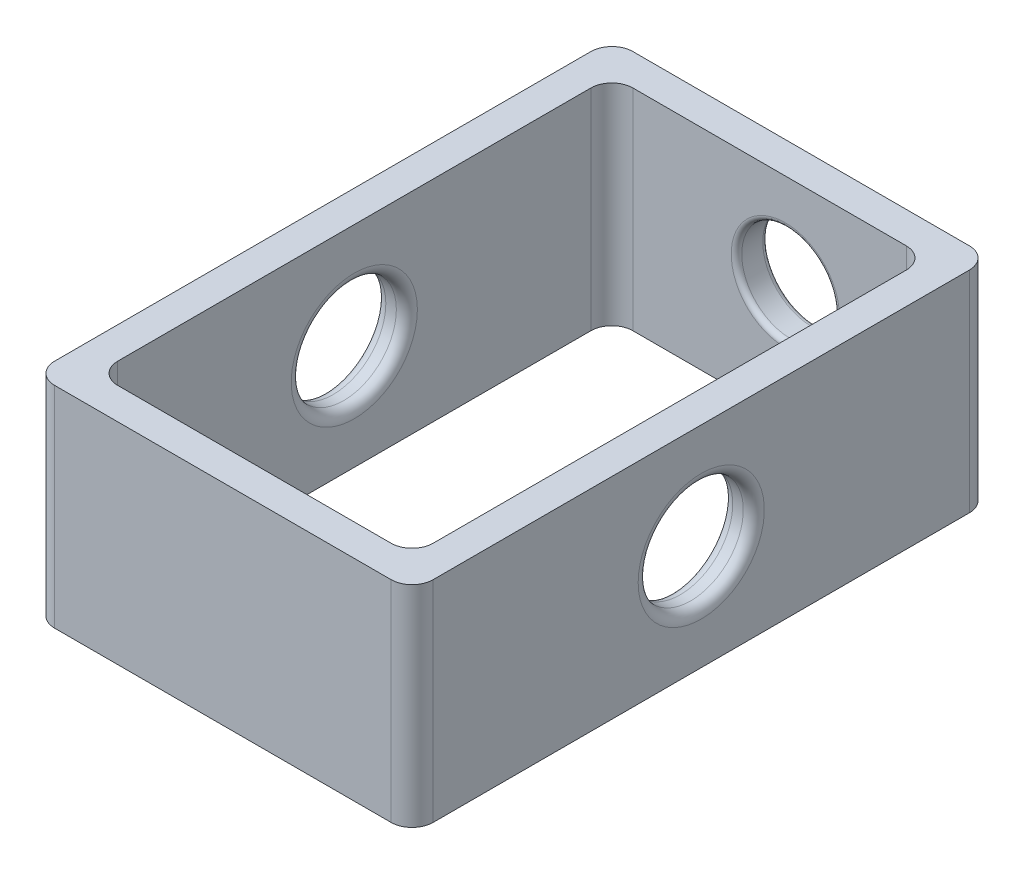
ISO-10303-21;
HEADER;
FILE_DESCRIPTION(('STEP AP214'),'2;1');
FILE_NAME('part.step','',(''),(''),'','','');
FILE_SCHEMA(('AUTOMOTIVE_DESIGN { 1 0 10303 214 1 1 1 1 }'));
ENDSEC;
DATA;
#1=APPLICATION_CONTEXT('core data for automotive mechanical design processes');
#2=APPLICATION_PROTOCOL_DEFINITION('international standard','automotive_design',2000,#1);
#3=PRODUCT_CONTEXT('',#1,'mechanical');
#4=PRODUCT('Part','Part','',(#3));
#5=PRODUCT_RELATED_PRODUCT_CATEGORY('part','',(#4));
#6=PRODUCT_DEFINITION_FORMATION('','',#4);
#7=PRODUCT_DEFINITION_CONTEXT('part definition',#1,'design');
#8=PRODUCT_DEFINITION('design','',#6,#7);
#9=PRODUCT_DEFINITION_SHAPE('','',#8);
#10=(LENGTH_UNIT() NAMED_UNIT(*) SI_UNIT(.MILLI.,.METRE.));
#11=(NAMED_UNIT(*) PLANE_ANGLE_UNIT() SI_UNIT($,.RADIAN.));
#12=(NAMED_UNIT(*) SI_UNIT($,.STERADIAN.) SOLID_ANGLE_UNIT());
#13=UNCERTAINTY_MEASURE_WITH_UNIT(LENGTH_MEASURE(1.E-05),#10,'distance_accuracy_value','');
#14=(GEOMETRIC_REPRESENTATION_CONTEXT(3) GLOBAL_UNCERTAINTY_ASSIGNED_CONTEXT((#13)) GLOBAL_UNIT_ASSIGNED_CONTEXT((#10,
#11,#12)) REPRESENTATION_CONTEXT('',''));
#15=CARTESIAN_POINT('',(0.,0.,0.));
#16=DIRECTION('',(0.,0.,1.));
#17=DIRECTION('',(1.,0.,0.));
#18=AXIS2_PLACEMENT_3D('',#15,#16,#17);
#19=CARTESIAN_POINT('',(-18.,10.,-27.5));
#20=DIRECTION('',(0.,0.,1.));
#21=DIRECTION('',(1.,0.,0.));
#22=AXIS2_PLACEMENT_3D('',#19,#20,#21);
#23=PLANE('',#22);
#24=CARTESIAN_POINT('',(1.50000000000001,1.,-27.5));
#25=DIRECTION('',(0.,0.,1.));
#26=DIRECTION('',(1.,0.,0.));
#27=AXIS2_PLACEMENT_3D('',#24,#25,#26);
#28=CIRCLE('',#27,5.15);
#29=CARTESIAN_POINT('',(6.65000000000001,1.,-27.5));
#30=VERTEX_POINT('',#29);
#31=EDGE_CURVE('E264',#30,#30,#28,.T.);
#32=ORIENTED_EDGE('',*,*,#31,.T.);
#33=EDGE_LOOP('',(#32));
#34=FACE_BOUND('',#33,.T.);
#35=DIRECTION('',(-1.,0.,0.));
#36=VECTOR('',#35,1.);
#37=CARTESIAN_POINT('',(-18.,10.,-27.5));
#38=LINE('',#37,#36);
#39=CARTESIAN_POINT('',(16.,10.,-27.5));
#40=VERTEX_POINT('',#39);
#41=CARTESIAN_POINT('',(-16.,10.,-27.5));
#42=VERTEX_POINT('',#41);
#43=EDGE_CURVE('E174',#40,#42,#38,.T.);
#44=ORIENTED_EDGE('',*,*,#43,.F.);
#45=DIRECTION('',(0.,-1.,0.));
#46=VECTOR('',#45,1.);
#47=CARTESIAN_POINT('',(16.,10.,-27.5));
#48=LINE('',#47,#46);
#49=CARTESIAN_POINT('',(16.,-10.,-27.5));
#50=VERTEX_POINT('',#49);
#51=EDGE_CURVE('E157',#40,#50,#48,.T.);
#52=ORIENTED_EDGE('',*,*,#51,.T.);
#53=DIRECTION('',(-1.,0.,0.));
#54=VECTOR('',#53,1.);
#55=CARTESIAN_POINT('',(-18.,-10.,-27.5));
#56=LINE('',#55,#54);
#57=CARTESIAN_POINT('',(-16.,-10.,-27.5));
#58=VERTEX_POINT('',#57);
#59=EDGE_CURVE('E175',#50,#58,#56,.T.);
#60=ORIENTED_EDGE('',*,*,#59,.T.);
#61=DIRECTION('',(0.,-1.,0.));
#62=VECTOR('',#61,1.);
#63=CARTESIAN_POINT('',(-16.,10.,-27.5));
#64=LINE('',#63,#62);
#65=EDGE_CURVE('E180',#58,#42,#64,.F.);
#66=ORIENTED_EDGE('',*,*,#65,.T.);
#67=EDGE_LOOP('',(#44,#52,#60,#66));
#68=FACE_BOUND('',#67,.T.);
#69=ADVANCED_FACE('F41',(#34,#68),#23,.F.);
#70=CARTESIAN_POINT('',(0.,10.,0.));
#71=DIRECTION('',(0.,-1.,0.));
#72=DIRECTION('',(0.,0.,-1.));
#73=AXIS2_PLACEMENT_3D('',#70,#71,#72);
#74=PLANE('',#73);
#75=DIRECTION('',(0.,0.,-1.));
#76=VECTOR('',#75,1.);
#77=CARTESIAN_POINT('',(18.,10.,27.5));
#78=LINE('',#77,#76);
#79=CARTESIAN_POINT('',(18.,10.,25.5));
#80=VERTEX_POINT('',#79);
#81=CARTESIAN_POINT('',(18.,10.,-25.5));
#82=VERTEX_POINT('',#81);
#83=EDGE_CURVE('E195',#80,#82,#78,.T.);
#84=ORIENTED_EDGE('',*,*,#83,.T.);
#85=CARTESIAN_POINT('',(16.,10.,-25.5));
#86=DIRECTION('',(0.,-1.,0.));
#87=DIRECTION('',(0.,0.,-1.));
#88=AXIS2_PLACEMENT_3D('',#85,#86,#87);
#89=CIRCLE('',#88,2.);
#90=EDGE_CURVE('E208',#82,#40,#89,.F.);
#91=ORIENTED_EDGE('',*,*,#90,.T.);
#92=ORIENTED_EDGE('',*,*,#43,.T.);
#93=CARTESIAN_POINT('',(-16.,10.,-25.5));
#94=DIRECTION('',(0.,-1.,0.));
#95=DIRECTION('',(0.,0.,-1.));
#96=AXIS2_PLACEMENT_3D('',#93,#94,#95);
#97=CIRCLE('',#96,2.);
#98=CARTESIAN_POINT('',(-18.,10.,-25.5));
#99=VERTEX_POINT('',#98);
#100=EDGE_CURVE('E206',#42,#99,#97,.F.);
#101=ORIENTED_EDGE('',*,*,#100,.T.);
#102=DIRECTION('',(0.,0.,1.));
#103=VECTOR('',#102,1.);
#104=CARTESIAN_POINT('',(-18.,10.,27.5));
#105=LINE('',#104,#103);
#106=CARTESIAN_POINT('',(-18.,10.,25.5));
#107=VERTEX_POINT('',#106);
#108=EDGE_CURVE('E411',#99,#107,#105,.T.);
#109=ORIENTED_EDGE('',*,*,#108,.T.);
#110=CARTESIAN_POINT('',(-16.,10.,25.5));
#111=DIRECTION('',(0.,-1.,0.));
#112=DIRECTION('',(0.,0.,-1.));
#113=AXIS2_PLACEMENT_3D('',#110,#111,#112);
#114=CIRCLE('',#113,2.);
#115=CARTESIAN_POINT('',(-16.,10.,27.5));
#116=VERTEX_POINT('',#115);
#117=EDGE_CURVE('E207',#107,#116,#114,.F.);
#118=ORIENTED_EDGE('',*,*,#117,.T.);
#119=DIRECTION('',(1.,0.,0.));
#120=VECTOR('',#119,1.);
#121=CARTESIAN_POINT('',(-18.,10.,27.5));
#122=LINE('',#121,#120);
#123=CARTESIAN_POINT('',(16.,10.,27.5));
#124=VERTEX_POINT('',#123);
#125=EDGE_CURVE('E191',#116,#124,#122,.T.);
#126=ORIENTED_EDGE('',*,*,#125,.T.);
#127=CARTESIAN_POINT('',(16.,10.,25.5));
#128=DIRECTION('',(0.,-1.,0.));
#129=DIRECTION('',(0.,0.,-1.));
#130=AXIS2_PLACEMENT_3D('',#127,#128,#129);
#131=CIRCLE('',#130,2.);
#132=EDGE_CURVE('E203',#124,#80,#131,.F.);
#133=ORIENTED_EDGE('',*,*,#132,.T.);
#134=EDGE_LOOP('',(#84,#91,#92,#101,#109,#118,#126,#133));
#135=FACE_BOUND('',#134,.T.);
#136=DIRECTION('',(0.,0.,1.));
#137=VECTOR('',#136,1.);
#138=CARTESIAN_POINT('',(-15.,10.,24.5));
#139=LINE('',#138,#137);
#140=CARTESIAN_POINT('',(-15.,10.,-22.5));
#141=VERTEX_POINT('',#140);
#142=CARTESIAN_POINT('',(-15.,10.,22.5));
#143=VERTEX_POINT('',#142);
#144=EDGE_CURVE('E430',#141,#143,#139,.T.);
#145=ORIENTED_EDGE('',*,*,#144,.F.);
#146=CARTESIAN_POINT('',(-13.,10.,-22.5));
#147=DIRECTION('',(0.,-1.,0.));
#148=DIRECTION('',(0.,0.,-1.));
#149=AXIS2_PLACEMENT_3D('',#146,#147,#148);
#150=CIRCLE('',#149,2.);
#151=CARTESIAN_POINT('',(-13.,10.,-24.5));
#152=VERTEX_POINT('',#151);
#153=EDGE_CURVE('E252',#141,#152,#150,.T.);
#154=ORIENTED_EDGE('',*,*,#153,.T.);
#155=DIRECTION('',(-1.,0.,0.));
#156=VECTOR('',#155,1.);
#157=CARTESIAN_POINT('',(15.,10.,-24.5));
#158=LINE('',#157,#156);
#159=CARTESIAN_POINT('',(13.,10.,-24.5));
#160=VERTEX_POINT('',#159);
#161=EDGE_CURVE('E189',#160,#152,#158,.T.);
#162=ORIENTED_EDGE('',*,*,#161,.F.);
#163=CARTESIAN_POINT('',(13.,10.,-22.5));
#164=DIRECTION('',(0.,-1.,0.));
#165=DIRECTION('',(0.,0.,-1.));
#166=AXIS2_PLACEMENT_3D('',#163,#164,#165);
#167=CIRCLE('',#166,2.);
#168=CARTESIAN_POINT('',(15.,10.,-22.5));
#169=VERTEX_POINT('',#168);
#170=EDGE_CURVE('E250',#160,#169,#167,.T.);
#171=ORIENTED_EDGE('',*,*,#170,.T.);
#172=DIRECTION('',(0.,0.,-1.));
#173=VECTOR('',#172,1.);
#174=CARTESIAN_POINT('',(15.,10.,24.5));
#175=LINE('',#174,#173);
#176=CARTESIAN_POINT('',(15.,10.,22.5));
#177=VERTEX_POINT('',#176);
#178=EDGE_CURVE('E437',#177,#169,#175,.T.);
#179=ORIENTED_EDGE('',*,*,#178,.F.);
#180=CARTESIAN_POINT('',(13.,10.,22.5));
#181=DIRECTION('',(0.,-1.,0.));
#182=DIRECTION('',(0.,0.,-1.));
#183=AXIS2_PLACEMENT_3D('',#180,#181,#182);
#184=CIRCLE('',#183,2.);
#185=CARTESIAN_POINT('',(13.,10.,24.5));
#186=VERTEX_POINT('',#185);
#187=EDGE_CURVE('E243',#177,#186,#184,.T.);
#188=ORIENTED_EDGE('',*,*,#187,.T.);
#189=DIRECTION('',(1.,0.,0.));
#190=VECTOR('',#189,1.);
#191=CARTESIAN_POINT('',(15.,10.,24.5));
#192=LINE('',#191,#190);
#193=CARTESIAN_POINT('',(-13.,10.,24.5));
#194=VERTEX_POINT('',#193);
#195=EDGE_CURVE('E445',#194,#186,#192,.T.);
#196=ORIENTED_EDGE('',*,*,#195,.F.);
#197=CARTESIAN_POINT('',(-13.,10.,22.5));
#198=DIRECTION('',(0.,-1.,0.));
#199=DIRECTION('',(0.,0.,-1.));
#200=AXIS2_PLACEMENT_3D('',#197,#198,#199);
#201=CIRCLE('',#200,2.);
#202=EDGE_CURVE('E57',#194,#143,#201,.T.);
#203=ORIENTED_EDGE('',*,*,#202,.T.);
#204=EDGE_LOOP('',(#145,#154,#162,#171,#179,#188,#196,#203));
#205=FACE_BOUND('',#204,.T.);
#206=ADVANCED_FACE('F311',(#135,#205),#74,.F.);
#207=CARTESIAN_POINT('',(0.,-10.,0.));
#208=DIRECTION('',(0.,-1.,0.));
#209=DIRECTION('',(0.,0.,-1.));
#210=AXIS2_PLACEMENT_3D('',#207,#208,#209);
#211=PLANE('',#210);
#212=ORIENTED_EDGE('',*,*,#59,.F.);
#213=CARTESIAN_POINT('',(16.,-10.,-25.5));
#214=DIRECTION('',(0.,-1.,0.));
#215=DIRECTION('',(0.,0.,-1.));
#216=AXIS2_PLACEMENT_3D('',#213,#214,#215);
#217=CIRCLE('',#216,2.);
#218=CARTESIAN_POINT('',(18.,-10.,-25.5));
#219=VERTEX_POINT('',#218);
#220=EDGE_CURVE('E159',#50,#219,#217,.T.);
#221=ORIENTED_EDGE('',*,*,#220,.T.);
#222=DIRECTION('',(0.,0.,-1.));
#223=VECTOR('',#222,1.);
#224=CARTESIAN_POINT('',(18.,-10.,27.5));
#225=LINE('',#224,#223);
#226=CARTESIAN_POINT('',(18.,-10.,25.5));
#227=VERTEX_POINT('',#226);
#228=EDGE_CURVE('E182',#227,#219,#225,.T.);
#229=ORIENTED_EDGE('',*,*,#228,.F.);
#230=CARTESIAN_POINT('',(16.,-10.,25.5));
#231=DIRECTION('',(0.,-1.,0.));
#232=DIRECTION('',(0.,0.,-1.));
#233=AXIS2_PLACEMENT_3D('',#230,#231,#232);
#234=CIRCLE('',#233,2.);
#235=CARTESIAN_POINT('',(16.,-10.,27.5));
#236=VERTEX_POINT('',#235);
#237=EDGE_CURVE('E176',#227,#236,#234,.T.);
#238=ORIENTED_EDGE('',*,*,#237,.T.);
#239=DIRECTION('',(1.,0.,0.));
#240=VECTOR('',#239,1.);
#241=CARTESIAN_POINT('',(-18.,-10.,27.5));
#242=LINE('',#241,#240);
#243=CARTESIAN_POINT('',(-16.,-10.,27.5));
#244=VERTEX_POINT('',#243);
#245=EDGE_CURVE('E187',#244,#236,#242,.T.);
#246=ORIENTED_EDGE('',*,*,#245,.F.);
#247=CARTESIAN_POINT('',(-16.,-10.,25.5));
#248=DIRECTION('',(0.,-1.,0.));
#249=DIRECTION('',(0.,0.,-1.));
#250=AXIS2_PLACEMENT_3D('',#247,#248,#249);
#251=CIRCLE('',#250,2.);
#252=CARTESIAN_POINT('',(-18.,-10.,25.5));
#253=VERTEX_POINT('',#252);
#254=EDGE_CURVE('E198',#244,#253,#251,.T.);
#255=ORIENTED_EDGE('',*,*,#254,.T.);
#256=DIRECTION('',(0.,0.,1.));
#257=VECTOR('',#256,1.);
#258=CARTESIAN_POINT('',(-18.,-10.,27.5));
#259=LINE('',#258,#257);
#260=CARTESIAN_POINT('',(-18.,-10.,-25.5));
#261=VERTEX_POINT('',#260);
#262=EDGE_CURVE('E185',#261,#253,#259,.T.);
#263=ORIENTED_EDGE('',*,*,#262,.F.);
#264=CARTESIAN_POINT('',(-16.,-10.,-25.5));
#265=DIRECTION('',(0.,-1.,0.));
#266=DIRECTION('',(0.,0.,-1.));
#267=AXIS2_PLACEMENT_3D('',#264,#265,#266);
#268=CIRCLE('',#267,2.);
#269=EDGE_CURVE('E170',#261,#58,#268,.T.);
#270=ORIENTED_EDGE('',*,*,#269,.T.);
#271=EDGE_LOOP('',(#212,#221,#229,#238,#246,#255,#263,#270));
#272=FACE_BOUND('',#271,.T.);
#273=DIRECTION('',(0.,0.,-1.));
#274=VECTOR('',#273,1.);
#275=CARTESIAN_POINT('',(15.,-10.,24.5));
#276=LINE('',#275,#274);
#277=CARTESIAN_POINT('',(15.,-10.,22.5));
#278=VERTEX_POINT('',#277);
#279=CARTESIAN_POINT('',(15.,-10.,-22.5));
#280=VERTEX_POINT('',#279);
#281=EDGE_CURVE('E426',#278,#280,#276,.T.);
#282=ORIENTED_EDGE('',*,*,#281,.T.);
#283=CARTESIAN_POINT('',(13.,-10.,-22.5));
#284=DIRECTION('',(0.,-1.,0.));
#285=DIRECTION('',(0.,0.,-1.));
#286=AXIS2_PLACEMENT_3D('',#283,#284,#285);
#287=CIRCLE('',#286,2.);
#288=CARTESIAN_POINT('',(13.,-10.,-24.5));
#289=VERTEX_POINT('',#288);
#290=EDGE_CURVE('E244',#280,#289,#287,.F.);
#291=ORIENTED_EDGE('',*,*,#290,.T.);
#292=DIRECTION('',(-1.,0.,0.));
#293=VECTOR('',#292,1.);
#294=CARTESIAN_POINT('',(15.,-10.,-24.5));
#295=LINE('',#294,#293);
#296=CARTESIAN_POINT('',(-13.,-10.,-24.5));
#297=VERTEX_POINT('',#296);
#298=EDGE_CURVE('E425',#289,#297,#295,.T.);
#299=ORIENTED_EDGE('',*,*,#298,.T.);
#300=CARTESIAN_POINT('',(-13.,-10.,-22.5));
#301=DIRECTION('',(0.,-1.,0.));
#302=DIRECTION('',(0.,0.,-1.));
#303=AXIS2_PLACEMENT_3D('',#300,#301,#302);
#304=CIRCLE('',#303,2.);
#305=CARTESIAN_POINT('',(-15.,-10.,-22.5));
#306=VERTEX_POINT('',#305);
#307=EDGE_CURVE('E248',#297,#306,#304,.F.);
#308=ORIENTED_EDGE('',*,*,#307,.T.);
#309=DIRECTION('',(0.,0.,1.));
#310=VECTOR('',#309,1.);
#311=CARTESIAN_POINT('',(-15.,-10.,24.5));
#312=LINE('',#311,#310);
#313=CARTESIAN_POINT('',(-15.,-10.,22.5));
#314=VERTEX_POINT('',#313);
#315=EDGE_CURVE('E432',#306,#314,#312,.T.);
#316=ORIENTED_EDGE('',*,*,#315,.T.);
#317=CARTESIAN_POINT('',(-13.,-10.,22.5));
#318=DIRECTION('',(0.,-1.,0.));
#319=DIRECTION('',(0.,0.,-1.));
#320=AXIS2_PLACEMENT_3D('',#317,#318,#319);
#321=CIRCLE('',#320,2.);
#322=CARTESIAN_POINT('',(-13.,-10.,24.5));
#323=VERTEX_POINT('',#322);
#324=EDGE_CURVE('E254',#314,#323,#321,.F.);
#325=ORIENTED_EDGE('',*,*,#324,.T.);
#326=DIRECTION('',(1.,0.,0.));
#327=VECTOR('',#326,1.);
#328=CARTESIAN_POINT('',(15.,-10.,24.5));
#329=LINE('',#328,#327);
#330=CARTESIAN_POINT('',(13.,-10.,24.5));
#331=VERTEX_POINT('',#330);
#332=EDGE_CURVE('E431',#323,#331,#329,.T.);
#333=ORIENTED_EDGE('',*,*,#332,.T.);
#334=CARTESIAN_POINT('',(13.,-10.,22.5));
#335=DIRECTION('',(0.,-1.,0.));
#336=DIRECTION('',(0.,0.,-1.));
#337=AXIS2_PLACEMENT_3D('',#334,#335,#336);
#338=CIRCLE('',#337,2.);
#339=EDGE_CURVE('E241',#331,#278,#338,.F.);
#340=ORIENTED_EDGE('',*,*,#339,.T.);
#341=EDGE_LOOP('',(#282,#291,#299,#308,#316,#325,#333,#340));
#342=FACE_BOUND('',#341,.T.);
#343=ADVANCED_FACE('F177',(#272,#342),#211,.T.);
#344=CARTESIAN_POINT('',(18.,10.,27.5));
#345=DIRECTION('',(-1.,0.,0.));
#346=DIRECTION('',(0.,0.,1.));
#347=AXIS2_PLACEMENT_3D('',#344,#345,#346);
#348=PLANE('',#347);
#349=CARTESIAN_POINT('',(18.,0.,0.));
#350=DIRECTION('',(-1.,0.,0.));
#351=DIRECTION('',(0.,0.,1.));
#352=AXIS2_PLACEMENT_3D('',#349,#350,#351);
#353=CIRCLE('',#352,6.);
#354=CARTESIAN_POINT('',(18.,0.,6.));
#355=VERTEX_POINT('',#354);
#356=EDGE_CURVE('E11',#355,#355,#353,.T.);
#357=ORIENTED_EDGE('',*,*,#356,.T.);
#358=EDGE_LOOP('',(#357));
#359=FACE_BOUND('',#358,.T.);
#360=ORIENTED_EDGE('',*,*,#228,.T.);
#361=DIRECTION('',(0.,-1.,0.));
#362=VECTOR('',#361,1.);
#363=CARTESIAN_POINT('',(18.,10.,-25.5));
#364=LINE('',#363,#362);
#365=EDGE_CURVE('E163',#219,#82,#364,.F.);
#366=ORIENTED_EDGE('',*,*,#365,.T.);
#367=ORIENTED_EDGE('',*,*,#83,.F.);
#368=DIRECTION('',(0.,-1.,0.));
#369=VECTOR('',#368,1.);
#370=CARTESIAN_POINT('',(18.,10.,25.5));
#371=LINE('',#370,#369);
#372=EDGE_CURVE('E168',#80,#227,#371,.T.);
#373=ORIENTED_EDGE('',*,*,#372,.T.);
#374=EDGE_LOOP('',(#360,#366,#367,#373));
#375=FACE_BOUND('',#374,.T.);
#376=ADVANCED_FACE('F321',(#359,#375),#348,.F.);
#377=CARTESIAN_POINT('',(-18.,10.,27.5));
#378=DIRECTION('',(1.,0.,0.));
#379=DIRECTION('',(0.,0.,-1.));
#380=AXIS2_PLACEMENT_3D('',#377,#378,#379);
#381=PLANE('',#380);
#382=CARTESIAN_POINT('',(-18.,0.,0.));
#383=DIRECTION('',(1.,0.,0.));
#384=DIRECTION('',(0.,0.,-1.));
#385=AXIS2_PLACEMENT_3D('',#382,#383,#384);
#386=CIRCLE('',#385,6.);
#387=CARTESIAN_POINT('',(-18.,0.,-6.));
#388=VERTEX_POINT('',#387);
#389=EDGE_CURVE('E274',#388,#388,#386,.T.);
#390=ORIENTED_EDGE('',*,*,#389,.T.);
#391=EDGE_LOOP('',(#390));
#392=FACE_BOUND('',#391,.T.);
#393=ORIENTED_EDGE('',*,*,#108,.F.);
#394=DIRECTION('',(0.,-1.,0.));
#395=VECTOR('',#394,1.);
#396=CARTESIAN_POINT('',(-18.,10.,-25.5));
#397=LINE('',#396,#395);
#398=EDGE_CURVE('E215',#99,#261,#397,.T.);
#399=ORIENTED_EDGE('',*,*,#398,.T.);
#400=ORIENTED_EDGE('',*,*,#262,.T.);
#401=DIRECTION('',(0.,-1.,0.));
#402=VECTOR('',#401,1.);
#403=CARTESIAN_POINT('',(-18.,10.,25.5));
#404=LINE('',#403,#402);
#405=EDGE_CURVE('E214',#253,#107,#404,.F.);
#406=ORIENTED_EDGE('',*,*,#405,.T.);
#407=EDGE_LOOP('',(#393,#399,#400,#406));
#408=FACE_BOUND('',#407,.T.);
#409=ADVANCED_FACE('F322',(#392,#408),#381,.F.);
#410=CARTESIAN_POINT('',(-18.,10.,27.5));
#411=DIRECTION('',(0.,0.,-1.));
#412=DIRECTION('',(-1.,0.,0.));
#413=AXIS2_PLACEMENT_3D('',#410,#411,#412);
#414=PLANE('',#413);
#415=ORIENTED_EDGE('',*,*,#125,.F.);
#416=DIRECTION('',(0.,-1.,0.));
#417=VECTOR('',#416,1.);
#418=CARTESIAN_POINT('',(-16.,10.,27.5));
#419=LINE('',#418,#417);
#420=EDGE_CURVE('E217',#116,#244,#419,.T.);
#421=ORIENTED_EDGE('',*,*,#420,.T.);
#422=ORIENTED_EDGE('',*,*,#245,.T.);
#423=DIRECTION('',(0.,-1.,0.));
#424=VECTOR('',#423,1.);
#425=CARTESIAN_POINT('',(16.,10.,27.5));
#426=LINE('',#425,#424);
#427=EDGE_CURVE('E220',#236,#124,#426,.F.);
#428=ORIENTED_EDGE('',*,*,#427,.T.);
#429=EDGE_LOOP('',(#415,#421,#422,#428));
#430=FACE_BOUND('',#429,.T.);
#431=ADVANCED_FACE('F394',(#430),#414,.F.);
#432=CARTESIAN_POINT('',(-15.,10.,24.5));
#433=DIRECTION('',(1.,0.,0.));
#434=DIRECTION('',(0.,0.,-1.));
#435=AXIS2_PLACEMENT_3D('',#432,#433,#434);
#436=PLANE('',#435);
#437=CARTESIAN_POINT('',(-15.,0.,0.));
#438=DIRECTION('',(1.,0.,0.));
#439=DIRECTION('',(0.,0.,-1.));
#440=AXIS2_PLACEMENT_3D('',#437,#438,#439);
#441=CIRCLE('',#440,6.);
#442=CARTESIAN_POINT('',(-15.,0.,-6.));
#443=VERTEX_POINT('',#442);
#444=EDGE_CURVE('E279',#443,#443,#441,.F.);
#445=ORIENTED_EDGE('',*,*,#444,.T.);
#446=EDGE_LOOP('',(#445));
#447=FACE_BOUND('',#446,.T.);
#448=ORIENTED_EDGE('',*,*,#315,.F.);
#449=DIRECTION('',(0.,-1.,0.));
#450=VECTOR('',#449,1.);
#451=CARTESIAN_POINT('',(-15.,10.,-22.5));
#452=LINE('',#451,#450);
#453=EDGE_CURVE('E62',#306,#141,#452,.F.);
#454=ORIENTED_EDGE('',*,*,#453,.T.);
#455=ORIENTED_EDGE('',*,*,#144,.T.);
#456=DIRECTION('',(0.,-1.,0.));
#457=VECTOR('',#456,1.);
#458=CARTESIAN_POINT('',(-15.,-10.,22.5));
#459=LINE('',#458,#457);
#460=EDGE_CURVE('E240',#143,#314,#459,.T.);
#461=ORIENTED_EDGE('',*,*,#460,.T.);
#462=EDGE_LOOP('',(#448,#454,#455,#461));
#463=FACE_BOUND('',#462,.T.);
#464=ADVANCED_FACE('F395',(#447,#463),#436,.T.);
#465=CARTESIAN_POINT('',(15.,10.,24.5));
#466=DIRECTION('',(0.,0.,-1.));
#467=DIRECTION('',(-1.,0.,0.));
#468=AXIS2_PLACEMENT_3D('',#465,#466,#467);
#469=PLANE('',#468);
#470=ORIENTED_EDGE('',*,*,#195,.T.);
#471=DIRECTION('',(0.,-1.,0.));
#472=VECTOR('',#471,1.);
#473=CARTESIAN_POINT('',(13.,-10.,24.5));
#474=LINE('',#473,#472);
#475=EDGE_CURVE('E223',#186,#331,#474,.T.);
#476=ORIENTED_EDGE('',*,*,#475,.T.);
#477=ORIENTED_EDGE('',*,*,#332,.F.);
#478=DIRECTION('',(0.,-1.,0.));
#479=VECTOR('',#478,1.);
#480=CARTESIAN_POINT('',(-13.,10.,24.5));
#481=LINE('',#480,#479);
#482=EDGE_CURVE('E221',#323,#194,#481,.F.);
#483=ORIENTED_EDGE('',*,*,#482,.T.);
#484=EDGE_LOOP('',(#470,#476,#477,#483));
#485=FACE_BOUND('',#484,.T.);
#486=ADVANCED_FACE('F390',(#485),#469,.T.);
#487=CARTESIAN_POINT('',(15.,10.,24.5));
#488=DIRECTION('',(-1.,0.,0.));
#489=DIRECTION('',(0.,0.,1.));
#490=AXIS2_PLACEMENT_3D('',#487,#488,#489);
#491=PLANE('',#490);
#492=CARTESIAN_POINT('',(15.,0.,0.));
#493=DIRECTION('',(-1.,0.,0.));
#494=DIRECTION('',(0.,0.,1.));
#495=AXIS2_PLACEMENT_3D('',#492,#493,#494);
#496=CIRCLE('',#495,6.);
#497=CARTESIAN_POINT('',(15.,0.,6.));
#498=VERTEX_POINT('',#497);
#499=EDGE_CURVE('E47',#498,#498,#496,.F.);
#500=ORIENTED_EDGE('',*,*,#499,.T.);
#501=EDGE_LOOP('',(#500));
#502=FACE_BOUND('',#501,.T.);
#503=ORIENTED_EDGE('',*,*,#281,.F.);
#504=DIRECTION('',(0.,-1.,0.));
#505=VECTOR('',#504,1.);
#506=CARTESIAN_POINT('',(15.,10.,22.5));
#507=LINE('',#506,#505);
#508=EDGE_CURVE('E229',#278,#177,#507,.F.);
#509=ORIENTED_EDGE('',*,*,#508,.T.);
#510=ORIENTED_EDGE('',*,*,#178,.T.);
#511=DIRECTION('',(0.,-1.,0.));
#512=VECTOR('',#511,1.);
#513=CARTESIAN_POINT('',(15.,-10.,-22.5));
#514=LINE('',#513,#512);
#515=EDGE_CURVE('E227',#169,#280,#514,.T.);
#516=ORIENTED_EDGE('',*,*,#515,.T.);
#517=EDGE_LOOP('',(#503,#509,#510,#516));
#518=FACE_BOUND('',#517,.T.);
#519=ADVANCED_FACE('F290',(#502,#518),#491,.T.);
#520=CARTESIAN_POINT('',(15.,10.,-24.5));
#521=DIRECTION('',(0.,0.,1.));
#522=DIRECTION('',(1.,0.,0.));
#523=AXIS2_PLACEMENT_3D('',#520,#521,#522);
#524=PLANE('',#523);
#525=CARTESIAN_POINT('',(1.50000000000001,1.,-24.5));
#526=DIRECTION('',(0.,0.,1.));
#527=DIRECTION('',(1.,0.,0.));
#528=AXIS2_PLACEMENT_3D('',#525,#526,#527);
#529=CIRCLE('',#528,5.15);
#530=CARTESIAN_POINT('',(6.65000000000001,1.,-24.5));
#531=VERTEX_POINT('',#530);
#532=EDGE_CURVE('E258',#531,#531,#529,.F.);
#533=ORIENTED_EDGE('',*,*,#532,.T.);
#534=EDGE_LOOP('',(#533));
#535=FACE_BOUND('',#534,.T.);
#536=ORIENTED_EDGE('',*,*,#298,.F.);
#537=DIRECTION('',(0.,-1.,0.));
#538=VECTOR('',#537,1.);
#539=CARTESIAN_POINT('',(13.,10.,-24.5));
#540=LINE('',#539,#538);
#541=EDGE_CURVE('E232',#289,#160,#540,.F.);
#542=ORIENTED_EDGE('',*,*,#541,.T.);
#543=ORIENTED_EDGE('',*,*,#161,.T.);
#544=DIRECTION('',(0.,-1.,0.));
#545=VECTOR('',#544,1.);
#546=CARTESIAN_POINT('',(-13.,-10.,-24.5));
#547=LINE('',#546,#545);
#548=EDGE_CURVE('E235',#152,#297,#547,.T.);
#549=ORIENTED_EDGE('',*,*,#548,.T.);
#550=EDGE_LOOP('',(#536,#542,#543,#549));
#551=FACE_BOUND('',#550,.T.);
#552=ADVANCED_FACE('F301',(#535,#551),#524,.T.);
#553=CARTESIAN_POINT('',(32.142135623731,0.,0.));
#554=DIRECTION('',(-1.,0.,0.));
#555=DIRECTION('',(0.,0.,1.));
#556=AXIS2_PLACEMENT_3D('',#553,#554,#555);
#557=CYLINDRICAL_SURFACE('',#556,5.);
#558=CARTESIAN_POINT('',(16.,0.,0.));
#559=DIRECTION('',(-1.,0.,0.));
#560=DIRECTION('',(0.,0.,1.));
#561=AXIS2_PLACEMENT_3D('',#558,#559,#560);
#562=CIRCLE('',#561,5.);
#563=CARTESIAN_POINT('',(16.,0.,5.));
#564=VERTEX_POINT('',#563);
#565=EDGE_CURVE('E283',#564,#564,#562,.T.);
#566=CARTESIAN_POINT('',(17.,0.,0.));
#567=DIRECTION('',(-1.,0.,0.));
#568=DIRECTION('',(0.,0.,1.));
#569=AXIS2_PLACEMENT_3D('',#566,#567,#568);
#570=CIRCLE('',#569,5.);
#571=CARTESIAN_POINT('',(17.,0.,5.));
#572=VERTEX_POINT('',#571);
#573=EDGE_CURVE('E276',#572,#572,#570,.F.);
#574=CARTESIAN_POINT('',(16.,0.,5.));
#575=CARTESIAN_POINT('',(16.0104166666667,0.,5.));
#576=CARTESIAN_POINT('',(16.0208333333333,0.,5.));
#577=CARTESIAN_POINT('',(16.0416666666667,0.,5.));
#578=CARTESIAN_POINT('',(16.0520833333333,0.,5.));
#579=CARTESIAN_POINT('',(16.0729166666667,0.,5.));
#580=CARTESIAN_POINT('',(16.0833333333333,0.,5.));
#581=CARTESIAN_POINT('',(16.1041666666667,0.,5.));
#582=CARTESIAN_POINT('',(16.1145833333333,0.,5.));
#583=CARTESIAN_POINT('',(16.1354166666667,0.,5.));
#584=CARTESIAN_POINT('',(16.1458333333333,0.,5.));
#585=CARTESIAN_POINT('',(16.1666666666667,0.,5.));
#586=CARTESIAN_POINT('',(16.1770833333333,0.,5.));
#587=CARTESIAN_POINT('',(16.1979166666667,0.,5.));
#588=CARTESIAN_POINT('',(16.2083333333333,0.,5.));
#589=CARTESIAN_POINT('',(16.2291666666667,0.,5.));
#590=CARTESIAN_POINT('',(16.2395833333333,0.,5.));
#591=CARTESIAN_POINT('',(16.2604166666667,0.,5.));
#592=CARTESIAN_POINT('',(16.2708333333333,0.,5.));
#593=CARTESIAN_POINT('',(16.2916666666667,0.,5.));
#594=CARTESIAN_POINT('',(16.3020833333333,0.,5.));
#595=CARTESIAN_POINT('',(16.3229166666667,0.,5.));
#596=CARTESIAN_POINT('',(16.3333333333333,0.,5.));
#597=CARTESIAN_POINT('',(16.3541666666667,0.,5.));
#598=CARTESIAN_POINT('',(16.3645833333333,0.,5.));
#599=CARTESIAN_POINT('',(16.3854166666667,0.,5.));
#600=CARTESIAN_POINT('',(16.3958333333333,0.,5.));
#601=CARTESIAN_POINT('',(16.4166666666667,0.,5.));
#602=CARTESIAN_POINT('',(16.4270833333333,0.,5.));
#603=CARTESIAN_POINT('',(16.4479166666667,0.,5.));
#604=CARTESIAN_POINT('',(16.4583333333333,0.,5.));
#605=CARTESIAN_POINT('',(16.4791666666667,0.,5.));
#606=CARTESIAN_POINT('',(16.4895833333333,0.,5.));
#607=CARTESIAN_POINT('',(16.5104166666667,0.,5.));
#608=CARTESIAN_POINT('',(16.5208333333333,0.,5.));
#609=CARTESIAN_POINT('',(16.5416666666667,0.,5.));
#610=CARTESIAN_POINT('',(16.5520833333333,0.,5.));
#611=CARTESIAN_POINT('',(16.5729166666667,0.,5.));
#612=CARTESIAN_POINT('',(16.5833333333333,0.,5.));
#613=CARTESIAN_POINT('',(16.6041666666667,0.,5.));
#614=CARTESIAN_POINT('',(16.6145833333333,0.,5.));
#615=CARTESIAN_POINT('',(16.6354166666667,0.,5.));
#616=CARTESIAN_POINT('',(16.6458333333333,0.,5.));
#617=CARTESIAN_POINT('',(16.6666666666667,0.,5.));
#618=CARTESIAN_POINT('',(16.6770833333333,0.,5.));
#619=CARTESIAN_POINT('',(16.6979166666667,0.,5.));
#620=CARTESIAN_POINT('',(16.7083333333333,0.,5.));
#621=CARTESIAN_POINT('',(16.7291666666667,0.,5.));
#622=CARTESIAN_POINT('',(16.7395833333333,0.,5.));
#623=CARTESIAN_POINT('',(16.7604166666667,0.,5.));
#624=CARTESIAN_POINT('',(16.7708333333333,0.,5.));
#625=CARTESIAN_POINT('',(16.7916666666667,0.,5.));
#626=CARTESIAN_POINT('',(16.8020833333333,0.,5.));
#627=CARTESIAN_POINT('',(16.8229166666667,0.,5.));
#628=CARTESIAN_POINT('',(16.8333333333333,0.,5.));
#629=CARTESIAN_POINT('',(16.8541666666667,0.,5.));
#630=CARTESIAN_POINT('',(16.8645833333333,0.,5.));
#631=CARTESIAN_POINT('',(16.8854166666667,0.,5.));
#632=CARTESIAN_POINT('',(16.8958333333333,0.,5.));
#633=CARTESIAN_POINT('',(16.9166666666667,0.,5.));
#634=CARTESIAN_POINT('',(16.9270833333333,0.,5.));
#635=CARTESIAN_POINT('',(16.9479166666667,0.,5.));
#636=CARTESIAN_POINT('',(16.9583333333333,0.,5.));
#637=CARTESIAN_POINT('',(16.9791666666667,0.,5.));
#638=CARTESIAN_POINT('',(16.9895833333333,0.,5.));
#639=CARTESIAN_POINT('',(17.,0.,5.));
#640=B_SPLINE_CURVE_WITH_KNOTS('',3,(#574,#575,#576,#577,#578,#579,#580,#581,#582,#583,#584,
#585,#586,#587,#588,#589,#590,#591,#592,#593,#594,#595,#596,#597,#598,#599,#600,#601,#602,#603,
#604,#605,#606,#607,#608,#609,#610,#611,#612,#613,#614,#615,#616,#617,#618,#619,#620,#621,#622,
#623,#624,#625,#626,#627,#628,#629,#630,#631,#632,#633,#634,#635,#636,#637,#638,#639),
.UNSPECIFIED.,.F.,.F.,(4,2,2,2,2,2,2,2,2,2,2,2,2,2,2,2,2,2,2,2,2,2,2,2,2,2,2,2,2,2,2,2,4),(0.,
0.03125,0.0625000000000001,0.0937500000000001,0.125,0.15625,0.1875,0.21875,0.25,0.28125,0.3125,
0.34375,0.375,0.40625,0.4375,0.46875,0.5,0.53125,0.5625,0.593750000000001,0.625000000000001,
0.656250000000001,0.687500000000001,0.718750000000001,0.750000000000004,0.781250000000001,
0.812500000000004,0.843750000000001,0.875000000000004,0.906250000000001,0.937500000000004,
0.968750000000001,1.),.UNSPECIFIED.);
#641=EDGE_CURVE('BSEAM300',#564,#572,#640,.T.);
#642=ORIENTED_EDGE('',*,*,#565,.T.);
#643=ORIENTED_EDGE('',*,*,#573,.T.);
#644=ORIENTED_EDGE('',*,*,#641,.T.);
#645=ORIENTED_EDGE('',*,*,#641,.F.);
#646=EDGE_LOOP('',(#642,#644,#643,#645));
#647=FACE_BOUND('',#646,.T.);
#648=ADVANCED_FACE('F300',(#647),#557,.F.);
#649=CARTESIAN_POINT('',(-17.,0.,0.));
#650=DIRECTION('',(1.,0.,0.));
#651=DIRECTION('',(0.,0.,-1.));
#652=AXIS2_PLACEMENT_3D('',#649,#650,#651);
#653=CIRCLE('',#652,5.);
#654=CARTESIAN_POINT('',(-17.,0.,5.));
#655=VERTEX_POINT('',#654);
#656=EDGE_CURVE('E272',#655,#655,#653,.F.);
#657=CARTESIAN_POINT('',(-16.,0.,0.));
#658=DIRECTION('',(1.,0.,0.));
#659=DIRECTION('',(0.,0.,-1.));
#660=AXIS2_PLACEMENT_3D('',#657,#658,#659);
#661=CIRCLE('',#660,5.);
#662=CARTESIAN_POINT('',(-16.,0.,5.));
#663=VERTEX_POINT('',#662);
#664=EDGE_CURVE('E270',#663,#663,#661,.T.);
#665=CARTESIAN_POINT('',(-17.,0.,5.));
#666=CARTESIAN_POINT('',(-16.9895833333333,0.,5.));
#667=CARTESIAN_POINT('',(-16.9791666666667,0.,5.));
#668=CARTESIAN_POINT('',(-16.9583333333333,0.,5.));
#669=CARTESIAN_POINT('',(-16.9479166666667,0.,5.));
#670=CARTESIAN_POINT('',(-16.9270833333333,0.,5.));
#671=CARTESIAN_POINT('',(-16.9166666666667,0.,5.));
#672=CARTESIAN_POINT('',(-16.8958333333333,0.,5.));
#673=CARTESIAN_POINT('',(-16.8854166666667,0.,5.));
#674=CARTESIAN_POINT('',(-16.8645833333333,0.,5.));
#675=CARTESIAN_POINT('',(-16.8541666666667,0.,5.));
#676=CARTESIAN_POINT('',(-16.8333333333333,0.,5.));
#677=CARTESIAN_POINT('',(-16.8229166666667,0.,5.));
#678=CARTESIAN_POINT('',(-16.8020833333333,0.,5.));
#679=CARTESIAN_POINT('',(-16.7916666666667,0.,5.));
#680=CARTESIAN_POINT('',(-16.7708333333333,0.,5.));
#681=CARTESIAN_POINT('',(-16.7604166666667,0.,5.));
#682=CARTESIAN_POINT('',(-16.7395833333333,0.,5.));
#683=CARTESIAN_POINT('',(-16.7291666666667,0.,5.));
#684=CARTESIAN_POINT('',(-16.7083333333333,0.,5.));
#685=CARTESIAN_POINT('',(-16.6979166666667,0.,5.));
#686=CARTESIAN_POINT('',(-16.6770833333333,0.,5.));
#687=CARTESIAN_POINT('',(-16.6666666666667,0.,5.));
#688=CARTESIAN_POINT('',(-16.6458333333333,0.,5.));
#689=CARTESIAN_POINT('',(-16.6354166666667,0.,5.));
#690=CARTESIAN_POINT('',(-16.6145833333333,0.,5.));
#691=CARTESIAN_POINT('',(-16.6041666666667,0.,5.));
#692=CARTESIAN_POINT('',(-16.5833333333333,0.,5.));
#693=CARTESIAN_POINT('',(-16.5729166666667,0.,5.));
#694=CARTESIAN_POINT('',(-16.5520833333333,0.,5.));
#695=CARTESIAN_POINT('',(-16.5416666666667,0.,5.));
#696=CARTESIAN_POINT('',(-16.5208333333333,0.,5.));
#697=CARTESIAN_POINT('',(-16.5104166666667,0.,5.));
#698=CARTESIAN_POINT('',(-16.4895833333333,0.,5.));
#699=CARTESIAN_POINT('',(-16.4791666666667,0.,5.));
#700=CARTESIAN_POINT('',(-16.4583333333333,0.,5.));
#701=CARTESIAN_POINT('',(-16.4479166666667,0.,5.));
#702=CARTESIAN_POINT('',(-16.4270833333333,0.,5.));
#703=CARTESIAN_POINT('',(-16.4166666666667,0.,5.));
#704=CARTESIAN_POINT('',(-16.3958333333333,0.,5.));
#705=CARTESIAN_POINT('',(-16.3854166666667,0.,5.));
#706=CARTESIAN_POINT('',(-16.3645833333333,0.,5.));
#707=CARTESIAN_POINT('',(-16.3541666666667,0.,5.));
#708=CARTESIAN_POINT('',(-16.3333333333333,0.,5.));
#709=CARTESIAN_POINT('',(-16.3229166666667,0.,5.));
#710=CARTESIAN_POINT('',(-16.3020833333333,0.,5.));
#711=CARTESIAN_POINT('',(-16.2916666666667,0.,5.));
#712=CARTESIAN_POINT('',(-16.2708333333333,0.,5.));
#713=CARTESIAN_POINT('',(-16.2604166666667,0.,5.));
#714=CARTESIAN_POINT('',(-16.2395833333333,0.,5.));
#715=CARTESIAN_POINT('',(-16.2291666666667,0.,5.));
#716=CARTESIAN_POINT('',(-16.2083333333333,0.,5.));
#717=CARTESIAN_POINT('',(-16.1979166666667,0.,5.));
#718=CARTESIAN_POINT('',(-16.1770833333333,0.,5.));
#719=CARTESIAN_POINT('',(-16.1666666666667,0.,5.));
#720=CARTESIAN_POINT('',(-16.1458333333333,0.,5.));
#721=CARTESIAN_POINT('',(-16.1354166666667,0.,5.));
#722=CARTESIAN_POINT('',(-16.1145833333333,0.,5.));
#723=CARTESIAN_POINT('',(-16.1041666666667,0.,5.));
#724=CARTESIAN_POINT('',(-16.0833333333333,0.,5.));
#725=CARTESIAN_POINT('',(-16.0729166666667,0.,5.));
#726=CARTESIAN_POINT('',(-16.0520833333333,0.,5.));
#727=CARTESIAN_POINT('',(-16.0416666666667,0.,5.));
#728=CARTESIAN_POINT('',(-16.0208333333333,0.,5.));
#729=CARTESIAN_POINT('',(-16.0104166666667,0.,5.));
#730=CARTESIAN_POINT('',(-16.,0.,5.));
#731=B_SPLINE_CURVE_WITH_KNOTS('',3,(#665,#666,#667,#668,#669,#670,#671,#672,#673,#674,#675,
#676,#677,#678,#679,#680,#681,#682,#683,#684,#685,#686,#687,#688,#689,#690,#691,#692,#693,#694,
#695,#696,#697,#698,#699,#700,#701,#702,#703,#704,#705,#706,#707,#708,#709,#710,#711,#712,#713,
#714,#715,#716,#717,#718,#719,#720,#721,#722,#723,#724,#725,#726,#727,#728,#729,#730),
.UNSPECIFIED.,.F.,.F.,(4,2,2,2,2,2,2,2,2,2,2,2,2,2,2,2,2,2,2,2,2,2,2,2,2,2,2,2,2,2,2,2,4),(0.,
0.0312499999999966,0.0625000000000001,0.0937500000000036,0.125,0.156249999999997,0.1875,
0.218750000000004,0.25,0.281249999999997,0.3125,0.343750000000004,0.375,0.406249999999997,
0.4375,0.468750000000004,0.5,0.531249999999997,0.5625,0.593750000000004,0.625000000000001,
0.656249999999997,0.687500000000001,0.718750000000004,0.750000000000001,0.781249999999997,
0.812500000000001,0.843750000000004,0.875000000000001,0.906249999999997,0.937500000000001,
0.968750000000004,1.),.UNSPECIFIED.);
#732=EDGE_CURVE('BSEAM297',#655,#663,#731,.T.);
#733=ORIENTED_EDGE('',*,*,#656,.T.);
#734=ORIENTED_EDGE('',*,*,#664,.T.);
#735=ORIENTED_EDGE('',*,*,#732,.T.);
#736=ORIENTED_EDGE('',*,*,#732,.F.);
#737=EDGE_LOOP('',(#733,#735,#734,#736));
#738=FACE_BOUND('',#737,.T.);
#739=ADVANCED_FACE('F297',(#738),#557,.F.);
#740=CARTESIAN_POINT('',(16.,10.,-25.5));
#741=DIRECTION('',(0.,-1.,0.));
#742=DIRECTION('',(0.,0.,-1.));
#743=AXIS2_PLACEMENT_3D('',#740,#741,#742);
#744=CYLINDRICAL_SURFACE('',#743,2.);
#745=ORIENTED_EDGE('',*,*,#90,.F.);
#746=ORIENTED_EDGE('',*,*,#365,.F.);
#747=ORIENTED_EDGE('',*,*,#220,.F.);
#748=ORIENTED_EDGE('',*,*,#51,.F.);
#749=EDGE_LOOP('',(#745,#746,#747,#748));
#750=FACE_BOUND('',#749,.T.);
#751=ADVANCED_FACE('F158',(#750),#744,.T.);
#752=CARTESIAN_POINT('',(-16.,10.,-25.5));
#753=DIRECTION('',(0.,-1.,0.));
#754=DIRECTION('',(0.,0.,-1.));
#755=AXIS2_PLACEMENT_3D('',#752,#753,#754);
#756=CYLINDRICAL_SURFACE('',#755,2.);
#757=ORIENTED_EDGE('',*,*,#100,.F.);
#758=ORIENTED_EDGE('',*,*,#65,.F.);
#759=ORIENTED_EDGE('',*,*,#269,.F.);
#760=ORIENTED_EDGE('',*,*,#398,.F.);
#761=EDGE_LOOP('',(#757,#758,#759,#760));
#762=FACE_BOUND('',#761,.T.);
#763=ADVANCED_FACE('F334',(#762),#756,.T.);
#764=CARTESIAN_POINT('',(-16.,10.,25.5));
#765=DIRECTION('',(0.,-1.,0.));
#766=DIRECTION('',(0.,0.,-1.));
#767=AXIS2_PLACEMENT_3D('',#764,#765,#766);
#768=CYLINDRICAL_SURFACE('',#767,2.);
#769=ORIENTED_EDGE('',*,*,#117,.F.);
#770=ORIENTED_EDGE('',*,*,#405,.F.);
#771=ORIENTED_EDGE('',*,*,#254,.F.);
#772=ORIENTED_EDGE('',*,*,#420,.F.);
#773=EDGE_LOOP('',(#769,#770,#771,#772));
#774=FACE_BOUND('',#773,.T.);
#775=ADVANCED_FACE('F333',(#774),#768,.T.);
#776=CARTESIAN_POINT('',(16.,10.,25.5));
#777=DIRECTION('',(0.,-1.,0.));
#778=DIRECTION('',(0.,0.,-1.));
#779=AXIS2_PLACEMENT_3D('',#776,#777,#778);
#780=CYLINDRICAL_SURFACE('',#779,2.);
#781=ORIENTED_EDGE('',*,*,#132,.F.);
#782=ORIENTED_EDGE('',*,*,#427,.F.);
#783=ORIENTED_EDGE('',*,*,#237,.F.);
#784=ORIENTED_EDGE('',*,*,#372,.F.);
#785=EDGE_LOOP('',(#781,#782,#783,#784));
#786=FACE_BOUND('',#785,.T.);
#787=ADVANCED_FACE('F336',(#786),#780,.T.);
#788=CARTESIAN_POINT('',(13.,10.,22.5));
#789=DIRECTION('',(0.,1.,0.));
#790=DIRECTION('',(0.,0.,1.));
#791=AXIS2_PLACEMENT_3D('',#788,#789,#790);
#792=CYLINDRICAL_SURFACE('',#791,2.);
#793=ORIENTED_EDGE('',*,*,#187,.F.);
#794=ORIENTED_EDGE('',*,*,#508,.F.);
#795=ORIENTED_EDGE('',*,*,#339,.F.);
#796=ORIENTED_EDGE('',*,*,#475,.F.);
#797=EDGE_LOOP('',(#793,#794,#795,#796));
#798=FACE_BOUND('',#797,.T.);
#799=ADVANCED_FACE('F344',(#798),#792,.F.);
#800=CARTESIAN_POINT('',(13.,10.,-22.5));
#801=DIRECTION('',(0.,1.,0.));
#802=DIRECTION('',(0.,0.,1.));
#803=AXIS2_PLACEMENT_3D('',#800,#801,#802);
#804=CYLINDRICAL_SURFACE('',#803,2.);
#805=ORIENTED_EDGE('',*,*,#170,.F.);
#806=ORIENTED_EDGE('',*,*,#541,.F.);
#807=ORIENTED_EDGE('',*,*,#290,.F.);
#808=ORIENTED_EDGE('',*,*,#515,.F.);
#809=EDGE_LOOP('',(#805,#806,#807,#808));
#810=FACE_BOUND('',#809,.T.);
#811=ADVANCED_FACE('F346',(#810),#804,.F.);
#812=CARTESIAN_POINT('',(-13.,10.,-22.5));
#813=DIRECTION('',(0.,1.,0.));
#814=DIRECTION('',(0.,0.,1.));
#815=AXIS2_PLACEMENT_3D('',#812,#813,#814);
#816=CYLINDRICAL_SURFACE('',#815,2.);
#817=ORIENTED_EDGE('',*,*,#153,.F.);
#818=ORIENTED_EDGE('',*,*,#453,.F.);
#819=ORIENTED_EDGE('',*,*,#307,.F.);
#820=ORIENTED_EDGE('',*,*,#548,.F.);
#821=EDGE_LOOP('',(#817,#818,#819,#820));
#822=FACE_BOUND('',#821,.T.);
#823=ADVANCED_FACE('F349',(#822),#816,.F.);
#824=CARTESIAN_POINT('',(-13.,10.,22.5));
#825=DIRECTION('',(0.,1.,0.));
#826=DIRECTION('',(0.,0.,1.));
#827=AXIS2_PLACEMENT_3D('',#824,#825,#826);
#828=CYLINDRICAL_SURFACE('',#827,2.);
#829=ORIENTED_EDGE('',*,*,#202,.F.);
#830=ORIENTED_EDGE('',*,*,#482,.F.);
#831=ORIENTED_EDGE('',*,*,#324,.F.);
#832=ORIENTED_EDGE('',*,*,#460,.F.);
#833=EDGE_LOOP('',(#829,#830,#831,#832));
#834=FACE_BOUND('',#833,.T.);
#835=ADVANCED_FACE('F353',(#834),#828,.F.);
#836=CARTESIAN_POINT('',(1.50000000000001,1.,-27.500012));
#837=DIRECTION('',(0.,0.,1.));
#838=DIRECTION('',(1.,0.,0.));
#839=AXIS2_PLACEMENT_3D('',#836,#837,#838);
#840=CYLINDRICAL_SURFACE('',#839,4.65);
#841=CARTESIAN_POINT('',(1.50000000000001,1.,-25.));
#842=DIRECTION('',(0.,0.,1.));
#843=DIRECTION('',(1.,0.,0.));
#844=AXIS2_PLACEMENT_3D('',#841,#842,#843);
#845=CIRCLE('',#844,4.65);
#846=CARTESIAN_POINT('',(6.15000000000001,1.,-25.));
#847=VERTEX_POINT('',#846);
#848=EDGE_CURVE('E265',#847,#847,#845,.T.);
#849=CARTESIAN_POINT('',(1.50000000000001,1.,-27.));
#850=DIRECTION('',(0.,0.,1.));
#851=DIRECTION('',(1.,0.,0.));
#852=AXIS2_PLACEMENT_3D('',#849,#850,#851);
#853=CIRCLE('',#852,4.65);
#854=CARTESIAN_POINT('',(6.15000000000001,1.,-27.));
#855=VERTEX_POINT('',#854);
#856=EDGE_CURVE('E260',#855,#855,#853,.F.);
#857=CARTESIAN_POINT('',(6.15000000000001,1.,-25.));
#858=CARTESIAN_POINT('',(6.15000000000001,1.,-25.0208333333333));
#859=CARTESIAN_POINT('',(6.15000000000001,1.,-25.0416666666667));
#860=CARTESIAN_POINT('',(6.15000000000001,1.,-25.0833333333333));
#861=CARTESIAN_POINT('',(6.15000000000001,1.,-25.1041666666667));
#862=CARTESIAN_POINT('',(6.15000000000001,1.,-25.1458333333333));
#863=CARTESIAN_POINT('',(6.15000000000001,1.,-25.1666666666667));
#864=CARTESIAN_POINT('',(6.15000000000001,1.,-25.2083333333333));
#865=CARTESIAN_POINT('',(6.15000000000001,1.,-25.2291666666667));
#866=CARTESIAN_POINT('',(6.15000000000001,1.,-25.2708333333333));
#867=CARTESIAN_POINT('',(6.15000000000001,1.,-25.2916666666667));
#868=CARTESIAN_POINT('',(6.15000000000001,1.,-25.3333333333333));
#869=CARTESIAN_POINT('',(6.15000000000001,1.,-25.3541666666667));
#870=CARTESIAN_POINT('',(6.15000000000001,1.,-25.3958333333333));
#871=CARTESIAN_POINT('',(6.15000000000001,1.,-25.4166666666667));
#872=CARTESIAN_POINT('',(6.15000000000001,1.,-25.4583333333333));
#873=CARTESIAN_POINT('',(6.15000000000001,1.,-25.4791666666667));
#874=CARTESIAN_POINT('',(6.15000000000001,1.,-25.5208333333333));
#875=CARTESIAN_POINT('',(6.15000000000001,1.,-25.5416666666667));
#876=CARTESIAN_POINT('',(6.15000000000001,1.,-25.5833333333333));
#877=CARTESIAN_POINT('',(6.15000000000001,1.,-25.6041666666667));
#878=CARTESIAN_POINT('',(6.15000000000001,1.,-25.6458333333333));
#879=CARTESIAN_POINT('',(6.15000000000001,1.,-25.6666666666667));
#880=CARTESIAN_POINT('',(6.15000000000001,1.,-25.7083333333333));
#881=CARTESIAN_POINT('',(6.15000000000001,1.,-25.7291666666667));
#882=CARTESIAN_POINT('',(6.15000000000001,1.,-25.7708333333333));
#883=CARTESIAN_POINT('',(6.15000000000001,1.,-25.7916666666667));
#884=CARTESIAN_POINT('',(6.15000000000001,1.,-25.8333333333333));
#885=CARTESIAN_POINT('',(6.15000000000001,1.,-25.8541666666667));
#886=CARTESIAN_POINT('',(6.15000000000001,1.,-25.8958333333333));
#887=CARTESIAN_POINT('',(6.15000000000001,1.,-25.9166666666667));
#888=CARTESIAN_POINT('',(6.15000000000001,1.,-25.9583333333333));
#889=CARTESIAN_POINT('',(6.15000000000001,1.,-25.9791666666667));
#890=CARTESIAN_POINT('',(6.15000000000001,1.,-26.0208333333333));
#891=CARTESIAN_POINT('',(6.15000000000001,1.,-26.0416666666667));
#892=CARTESIAN_POINT('',(6.15000000000001,1.,-26.0833333333333));
#893=CARTESIAN_POINT('',(6.15000000000001,1.,-26.1041666666667));
#894=CARTESIAN_POINT('',(6.15000000000001,1.,-26.1458333333333));
#895=CARTESIAN_POINT('',(6.15000000000001,1.,-26.1666666666667));
#896=CARTESIAN_POINT('',(6.15000000000001,1.,-26.2083333333333));
#897=CARTESIAN_POINT('',(6.15000000000001,1.,-26.2291666666667));
#898=CARTESIAN_POINT('',(6.15000000000001,1.,-26.2708333333333));
#899=CARTESIAN_POINT('',(6.15000000000001,1.,-26.2916666666667));
#900=CARTESIAN_POINT('',(6.15000000000001,1.,-26.3333333333333));
#901=CARTESIAN_POINT('',(6.15000000000001,1.,-26.3541666666667));
#902=CARTESIAN_POINT('',(6.15000000000001,1.,-26.3958333333333));
#903=CARTESIAN_POINT('',(6.15000000000001,1.,-26.4166666666667));
#904=CARTESIAN_POINT('',(6.15000000000001,1.,-26.4583333333333));
#905=CARTESIAN_POINT('',(6.15000000000001,1.,-26.4791666666667));
#906=CARTESIAN_POINT('',(6.15000000000001,1.,-26.5208333333333));
#907=CARTESIAN_POINT('',(6.15000000000001,1.,-26.5416666666667));
#908=CARTESIAN_POINT('',(6.15000000000001,1.,-26.5833333333333));
#909=CARTESIAN_POINT('',(6.15000000000001,1.,-26.6041666666667));
#910=CARTESIAN_POINT('',(6.15000000000001,1.,-26.6458333333333));
#911=CARTESIAN_POINT('',(6.15000000000001,1.,-26.6666666666667));
#912=CARTESIAN_POINT('',(6.15000000000001,1.,-26.7083333333333));
#913=CARTESIAN_POINT('',(6.15000000000001,1.,-26.7291666666667));
#914=CARTESIAN_POINT('',(6.15000000000001,1.,-26.7708333333333));
#915=CARTESIAN_POINT('',(6.15000000000001,1.,-26.7916666666667));
#916=CARTESIAN_POINT('',(6.15000000000001,1.,-26.8333333333333));
#917=CARTESIAN_POINT('',(6.15000000000001,1.,-26.8541666666667));
#918=CARTESIAN_POINT('',(6.15000000000001,1.,-26.8958333333333));
#919=CARTESIAN_POINT('',(6.15000000000001,1.,-26.9166666666667));
#920=CARTESIAN_POINT('',(6.15000000000001,1.,-26.9583333333333));
#921=CARTESIAN_POINT('',(6.15000000000001,1.,-26.9791666666667));
#922=CARTESIAN_POINT('',(6.15000000000001,1.,-27.));
#923=B_SPLINE_CURVE_WITH_KNOTS('',3,(#857,#858,#859,#860,#861,#862,#863,#864,#865,#866,#867,
#868,#869,#870,#871,#872,#873,#874,#875,#876,#877,#878,#879,#880,#881,#882,#883,#884,#885,#886,
#887,#888,#889,#890,#891,#892,#893,#894,#895,#896,#897,#898,#899,#900,#901,#902,#903,#904,#905,
#906,#907,#908,#909,#910,#911,#912,#913,#914,#915,#916,#917,#918,#919,#920,#921,#922),
.UNSPECIFIED.,.F.,.F.,(4,2,2,2,2,2,2,2,2,2,2,2,2,2,2,2,2,2,2,2,2,2,2,2,2,2,2,2,2,2,2,2,4),(0.,
0.0625000000000001,0.125,0.1875,0.25,0.3125,0.375,0.4375,0.5,0.5625,0.625000000000001,
0.687500000000001,0.750000000000001,0.812500000000001,0.875000000000001,0.937500000000001,1.,
1.0625,1.125,1.1875,1.25,1.3125,1.375,1.4375,1.5,1.5625,1.625,1.6875,1.75,1.8125,1.875,1.9375,
2.),.UNSPECIFIED.);
#924=EDGE_CURVE('BSEAM357',#847,#855,#923,.T.);
#925=ORIENTED_EDGE('',*,*,#848,.T.);
#926=ORIENTED_EDGE('',*,*,#856,.T.);
#927=ORIENTED_EDGE('',*,*,#924,.T.);
#928=ORIENTED_EDGE('',*,*,#924,.F.);
#929=EDGE_LOOP('',(#925,#927,#926,#928));
#930=FACE_BOUND('',#929,.T.);
#931=ADVANCED_FACE('F357',(#930),#840,.F.);
#932=CARTESIAN_POINT('',(1.50000000000001,1.,-25.));
#933=DIRECTION('',(0.,0.,1.));
#934=DIRECTION('',(1.,0.,0.));
#935=AXIS2_PLACEMENT_3D('',#932,#933,#934);
#936=TOROIDAL_SURFACE('',#935,5.15,0.5);
#937=ORIENTED_EDGE('',*,*,#848,.F.);
#938=EDGE_LOOP('',(#937));
#939=FACE_BOUND('',#938,.T.);
#940=ORIENTED_EDGE('',*,*,#532,.F.);
#941=EDGE_LOOP('',(#940));
#942=FACE_BOUND('',#941,.T.);
#943=ADVANCED_FACE('F360',(#939,#942),#936,.T.);
#944=CARTESIAN_POINT('',(1.50000000000001,1.,-27.));
#945=DIRECTION('',(0.,0.,1.));
#946=DIRECTION('',(1.,0.,0.));
#947=AXIS2_PLACEMENT_3D('',#944,#945,#946);
#948=TOROIDAL_SURFACE('',#947,5.15,0.5);
#949=ORIENTED_EDGE('',*,*,#31,.F.);
#950=EDGE_LOOP('',(#949));
#951=FACE_BOUND('',#950,.T.);
#952=ORIENTED_EDGE('',*,*,#856,.F.);
#953=EDGE_LOOP('',(#952));
#954=FACE_BOUND('',#953,.T.);
#955=ADVANCED_FACE('F365',(#951,#954),#948,.T.);
#956=CARTESIAN_POINT('',(-17.,0.,0.));
#957=DIRECTION('',(1.,0.,0.));
#958=DIRECTION('',(0.,0.,-1.));
#959=AXIS2_PLACEMENT_3D('',#956,#957,#958);
#960=TOROIDAL_SURFACE('',#959,6.,1.);
#961=ORIENTED_EDGE('',*,*,#389,.F.);
#962=EDGE_LOOP('',(#961));
#963=FACE_BOUND('',#962,.T.);
#964=ORIENTED_EDGE('',*,*,#656,.F.);
#965=EDGE_LOOP('',(#964));
#966=FACE_BOUND('',#965,.T.);
#967=ADVANCED_FACE('F366',(#963,#966),#960,.T.);
#968=CARTESIAN_POINT('',(-16.,0.,0.));
#969=DIRECTION('',(1.,0.,0.));
#970=DIRECTION('',(0.,0.,-1.));
#971=AXIS2_PLACEMENT_3D('',#968,#969,#970);
#972=TOROIDAL_SURFACE('',#971,6.,1.);
#973=ORIENTED_EDGE('',*,*,#444,.F.);
#974=EDGE_LOOP('',(#973));
#975=FACE_BOUND('',#974,.T.);
#976=ORIENTED_EDGE('',*,*,#664,.F.);
#977=EDGE_LOOP('',(#976));
#978=FACE_BOUND('',#977,.T.);
#979=ADVANCED_FACE('F295',(#975,#978),#972,.T.);
#980=CARTESIAN_POINT('',(16.,0.,0.));
#981=DIRECTION('',(-1.,0.,0.));
#982=DIRECTION('',(0.,0.,1.));
#983=AXIS2_PLACEMENT_3D('',#980,#981,#982);
#984=TOROIDAL_SURFACE('',#983,6.,1.);
#985=ORIENTED_EDGE('',*,*,#499,.F.);
#986=EDGE_LOOP('',(#985));
#987=FACE_BOUND('',#986,.T.);
#988=ORIENTED_EDGE('',*,*,#565,.F.);
#989=EDGE_LOOP('',(#988));
#990=FACE_BOUND('',#989,.T.);
#991=ADVANCED_FACE('F293',(#987,#990),#984,.T.);
#992=CARTESIAN_POINT('',(17.,0.,0.));
#993=DIRECTION('',(-1.,0.,0.));
#994=DIRECTION('',(0.,0.,1.));
#995=AXIS2_PLACEMENT_3D('',#992,#993,#994);
#996=TOROIDAL_SURFACE('',#995,6.,1.);
#997=ORIENTED_EDGE('',*,*,#356,.F.);
#998=EDGE_LOOP('',(#997));
#999=FACE_BOUND('',#998,.T.);
#1000=ORIENTED_EDGE('',*,*,#573,.F.);
#1001=EDGE_LOOP('',(#1000));
#1002=FACE_BOUND('',#1001,.T.);
#1003=ADVANCED_FACE('F43',(#999,#1002),#996,.T.);
#1004=CLOSED_SHELL('',(#69,#206,#343,#376,#409,#431,#464,#486,#519,#552,#648,#739,#751,#763,
#775,#787,#799,#811,#823,#835,#931,#943,#955,#967,#979,#991,#1003));
#1005=MANIFOLD_SOLID_BREP('B2',#1004);
#1006=ADVANCED_BREP_SHAPE_REPRESENTATION('',(#18,#1005),#14);
#1007=SHAPE_DEFINITION_REPRESENTATION(#9,#1006);
ENDSEC;
END-ISO-10303-21;
